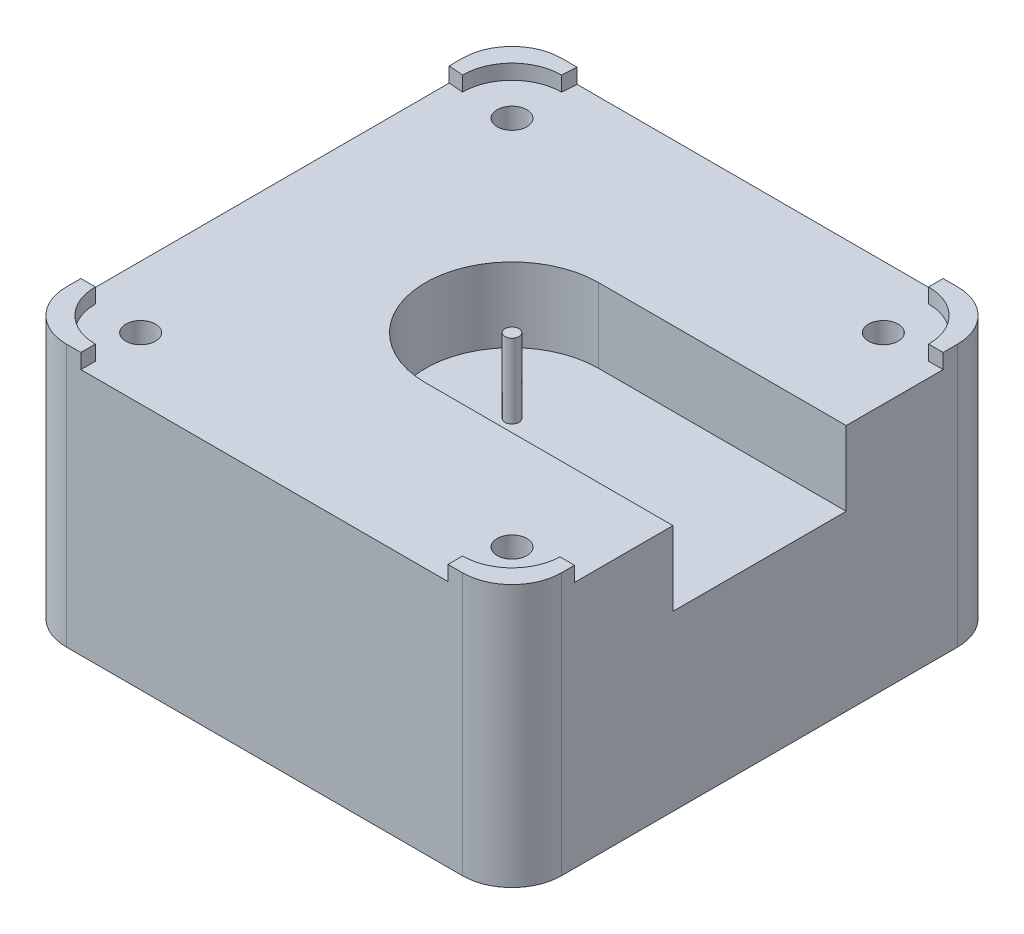
ISO-10303-21;
HEADER;
FILE_DESCRIPTION(('STEP AP214'),'2;1');
FILE_NAME('part.step','',(''),(''),'','','');
FILE_SCHEMA(('AUTOMOTIVE_DESIGN { 1 0 10303 214 1 1 1 1 }'));
ENDSEC;
DATA;
#1=APPLICATION_CONTEXT('core data for automotive mechanical design processes');
#2=APPLICATION_PROTOCOL_DEFINITION('international standard','automotive_design',2000,#1);
#3=PRODUCT_CONTEXT('',#1,'mechanical');
#4=PRODUCT('Part','Part','',(#3));
#5=PRODUCT_RELATED_PRODUCT_CATEGORY('part','',(#4));
#6=PRODUCT_DEFINITION_FORMATION('','',#4);
#7=PRODUCT_DEFINITION_CONTEXT('part definition',#1,'design');
#8=PRODUCT_DEFINITION('design','',#6,#7);
#9=PRODUCT_DEFINITION_SHAPE('','',#8);
#10=(LENGTH_UNIT() NAMED_UNIT(*) SI_UNIT(.MILLI.,.METRE.));
#11=(NAMED_UNIT(*) PLANE_ANGLE_UNIT() SI_UNIT($,.RADIAN.));
#12=(NAMED_UNIT(*) SI_UNIT($,.STERADIAN.) SOLID_ANGLE_UNIT());
#13=UNCERTAINTY_MEASURE_WITH_UNIT(LENGTH_MEASURE(1.E-05),#10,'distance_accuracy_value','');
#14=(GEOMETRIC_REPRESENTATION_CONTEXT(3) GLOBAL_UNCERTAINTY_ASSIGNED_CONTEXT((#13)) GLOBAL_UNIT_ASSIGNED_CONTEXT((#10,
#11,#12)) REPRESENTATION_CONTEXT('',''));
#15=CARTESIAN_POINT('',(0.,0.,0.));
#16=DIRECTION('',(0.,0.,1.));
#17=DIRECTION('',(1.,0.,0.));
#18=AXIS2_PLACEMENT_3D('',#15,#16,#17);
#19=CARTESIAN_POINT('',(0.,50.,0.));
#20=DIRECTION('',(0.,1.,0.));
#21=DIRECTION('',(0.,0.,1.));
#22=AXIS2_PLACEMENT_3D('',#19,#20,#21);
#23=PLANE('',#22);
#24=DIRECTION('',(0.,0.,1.));
#25=VECTOR('',#24,1.);
#26=CARTESIAN_POINT('',(-35.668490101477,50.,-9.29519148590413E-13));
#27=LINE('',#26,#25);
#28=CARTESIAN_POINT('',(-35.6684901014788,50.,69.0195136041323));
#29=VERTEX_POINT('',#28);
#30=CARTESIAN_POINT('',(-35.6684901014788,50.,71.9484457922669));
#31=VERTEX_POINT('',#30);
#32=EDGE_CURVE('E257',#29,#31,#27,.T.);
#33=ORIENTED_EDGE('',*,*,#32,.T.);
#34=DIRECTION('',(1.,0.,0.));
#35=VECTOR('',#34,1.);
#36=CARTESIAN_POINT('',(-48.5974222896133,50.,71.9484457922669));
#37=LINE('',#36,#35);
#38=CARTESIAN_POINT('',(38.4736455222521,50.,71.9484457922669));
#39=VERTEX_POINT('',#38);
#40=EDGE_CURVE('E442',#31,#39,#37,.T.);
#41=ORIENTED_EDGE('',*,*,#40,.T.);
#42=DIRECTION('',(0.,0.,1.));
#43=VECTOR('',#42,1.);
#44=CARTESIAN_POINT('',(38.4736455222504,50.,-9.11473968079353E-13));
#45=LINE('',#44,#43);
#46=CARTESIAN_POINT('',(38.4736455222521,50.,69.0195136041323));
#47=VERTEX_POINT('',#46);
#48=EDGE_CURVE('E327',#47,#39,#45,.T.);
#49=ORIENTED_EDGE('',*,*,#48,.F.);
#50=CARTESIAN_POINT('',(38.4736455222521,50.,59.0195136041323));
#51=DIRECTION('',(0.,1.,0.));
#52=DIRECTION('',(0.,0.,1.));
#53=AXIS2_PLACEMENT_3D('',#50,#51,#52);
#54=CIRCLE('',#53,10.);
#55=CARTESIAN_POINT('',(48.4689491929749,50.,59.3259520645704));
#56=VERTEX_POINT('',#55);
#57=EDGE_CURVE('E342',#56,#47,#54,.F.);
#58=ORIENTED_EDGE('',*,*,#57,.F.);
#59=DIRECTION('',(1.,0.,0.));
#60=VECTOR('',#59,1.);
#61=CARTESIAN_POINT('',(0.,50.,59.3259520645704));
#62=LINE('',#61,#60);
#63=CARTESIAN_POINT('',(51.4025777103867,50.,59.3259520645704));
#64=VERTEX_POINT('',#63);
#65=EDGE_CURVE('E322',#56,#64,#62,.T.);
#66=ORIENTED_EDGE('',*,*,#65,.T.);
#67=DIRECTION('',(0.,0.,-1.));
#68=VECTOR('',#67,1.);
#69=CARTESIAN_POINT('',(51.4025777103867,50.,-28.0515542077331));
#70=LINE('',#69,#68);
#71=CARTESIAN_POINT('',(51.4025777103867,50.,39.4484457922669));
#72=VERTEX_POINT('',#71);
#73=EDGE_CURVE('E446',#64,#72,#70,.T.);
#74=ORIENTED_EDGE('',*,*,#73,.T.);
#75=DIRECTION('',(1.,0.,0.));
#76=VECTOR('',#75,1.);
#77=CARTESIAN_POINT('',(1.40257771038666,50.,39.4484457922669));
#78=LINE('',#77,#76);
#79=CARTESIAN_POINT('',(1.40257771038666,50.,39.4484457922669));
#80=VERTEX_POINT('',#79);
#81=EDGE_CURVE('E428',#80,#72,#78,.T.);
#82=ORIENTED_EDGE('',*,*,#81,.F.);
#83=CARTESIAN_POINT('',(1.40257771038667,50.,21.9484457922669));
#84=DIRECTION('',(0.,1.,0.));
#85=DIRECTION('',(0.,0.,1.));
#86=AXIS2_PLACEMENT_3D('',#83,#84,#85);
#87=CIRCLE('',#86,17.5);
#88=CARTESIAN_POINT('',(1.40257771038666,50.,4.44844579226686));
#89=VERTEX_POINT('',#88);
#90=EDGE_CURVE('E232',#89,#80,#87,.T.);
#91=ORIENTED_EDGE('',*,*,#90,.F.);
#92=DIRECTION('',(-1.,0.,0.));
#93=VECTOR('',#92,1.);
#94=CARTESIAN_POINT('',(1.40257771038666,50.,4.44844579226686));
#95=LINE('',#94,#93);
#96=CARTESIAN_POINT('',(51.4025777103867,50.,4.44844579226687));
#97=VERTEX_POINT('',#96);
#98=EDGE_CURVE('E237',#97,#89,#95,.T.);
#99=ORIENTED_EDGE('',*,*,#98,.F.);
#100=CARTESIAN_POINT('',(51.4025777103867,50.,-15.1226220195985));
#101=VERTEX_POINT('',#100);
#102=EDGE_CURVE('E445',#97,#101,#70,.T.);
#103=ORIENTED_EDGE('',*,*,#102,.T.);
#104=DIRECTION('',(1.,0.,0.));
#105=VECTOR('',#104,1.);
#106=CARTESIAN_POINT('',(0.,50.,-15.1226220195985));
#107=LINE('',#106,#105);
#108=CARTESIAN_POINT('',(48.4736455222521,50.,-15.1226220195985));
#109=VERTEX_POINT('',#108);
#110=EDGE_CURVE('E359',#109,#101,#107,.T.);
#111=ORIENTED_EDGE('',*,*,#110,.F.);
#112=CARTESIAN_POINT('',(38.4736455222521,50.,-15.1226220195986));
#113=DIRECTION('',(0.,1.,0.));
#114=DIRECTION('',(0.,0.,1.));
#115=AXIS2_PLACEMENT_3D('',#112,#113,#114);
#116=CIRCLE('',#115,10.);
#117=CARTESIAN_POINT('',(38.4736455222521,50.,-25.1226220195986));
#118=VERTEX_POINT('',#117);
#119=EDGE_CURVE('E55',#118,#109,#116,.F.);
#120=ORIENTED_EDGE('',*,*,#119,.F.);
#121=DIRECTION('',(0.,0.,-1.));
#122=VECTOR('',#121,1.);
#123=CARTESIAN_POINT('',(38.4736455222521,50.,0.));
#124=LINE('',#123,#122);
#125=CARTESIAN_POINT('',(38.4736455222521,50.,-28.0515542077331));
#126=VERTEX_POINT('',#125);
#127=EDGE_CURVE('E60',#118,#126,#124,.T.);
#128=ORIENTED_EDGE('',*,*,#127,.T.);
#129=DIRECTION('',(-1.,0.,0.));
#130=VECTOR('',#129,1.);
#131=CARTESIAN_POINT('',(-48.5974222896134,50.,-28.0515542077331));
#132=LINE('',#131,#130);
#133=CARTESIAN_POINT('',(-35.4404761380209,50.,-28.0515542077331));
#134=VERTEX_POINT('',#133);
#135=EDGE_CURVE('E48',#126,#134,#132,.T.);
#136=ORIENTED_EDGE('',*,*,#135,.T.);
#137=DIRECTION('',(0.0776140043429379,0.,-0.996983483478966));
#138=VECTOR('',#137,1.);
#139=CARTESIAN_POINT('',(-37.3976109706205,50.,-2.91136050735838));
#140=LINE('',#139,#138);
#141=CARTESIAN_POINT('',(-35.6684901014788,50.,-25.1226220195986));
#142=VERTEX_POINT('',#141);
#143=EDGE_CURVE('E310',#142,#134,#140,.T.);
#144=ORIENTED_EDGE('',*,*,#143,.F.);
#145=CARTESIAN_POINT('',(-35.6684901014788,50.,-15.1226220195986));
#146=DIRECTION('',(0.,1.,0.));
#147=DIRECTION('',(0.,0.,1.));
#148=AXIS2_PLACEMENT_3D('',#145,#146,#147);
#149=CIRCLE('',#148,10.);
#150=CARTESIAN_POINT('',(-45.6684901014788,50.,-15.1226220195985));
#151=VERTEX_POINT('',#150);
#152=EDGE_CURVE('E289',#142,#151,#149,.T.);
#153=ORIENTED_EDGE('',*,*,#152,.T.);
#154=DIRECTION('',(-0.996309152553865,0.,-0.0858374774640981));
#155=VECTOR('',#154,1.);
#156=CARTESIAN_POINT('',(0.956807935292815,50.,-11.1055978266266));
#157=LINE('',#156,#155);
#158=CARTESIAN_POINT('',(-48.5974222896133,50.,-15.3749655316986));
#159=VERTEX_POINT('',#158);
#160=EDGE_CURVE('E294',#151,#159,#157,.T.);
#161=ORIENTED_EDGE('',*,*,#160,.T.);
#162=DIRECTION('',(0.,0.,1.));
#163=VECTOR('',#162,1.);
#164=CARTESIAN_POINT('',(-48.5974222896134,50.,-28.0515542077331));
#165=LINE('',#164,#163);
#166=CARTESIAN_POINT('',(-48.5974222896133,50.,59.0195136041323));
#167=VERTEX_POINT('',#166);
#168=EDGE_CURVE('E439',#159,#167,#165,.T.);
#169=ORIENTED_EDGE('',*,*,#168,.T.);
#170=DIRECTION('',(-1.,0.,0.));
#171=VECTOR('',#170,1.);
#172=CARTESIAN_POINT('',(1.53804570587249E-12,50.,59.0195136041311));
#173=LINE('',#172,#171);
#174=CARTESIAN_POINT('',(-45.6684901014788,50.,59.0195136041323));
#175=VERTEX_POINT('',#174);
#176=EDGE_CURVE('E262',#175,#167,#173,.T.);
#177=ORIENTED_EDGE('',*,*,#176,.F.);
#178=CARTESIAN_POINT('',(-35.6684901014788,50.,59.0195136041323));
#179=DIRECTION('',(0.,1.,0.));
#180=DIRECTION('',(0.,0.,1.));
#181=AXIS2_PLACEMENT_3D('',#178,#179,#180);
#182=CIRCLE('',#181,9.99999999999999);
#183=EDGE_CURVE('E277',#29,#175,#182,.F.);
#184=ORIENTED_EDGE('',*,*,#183,.F.);
#185=EDGE_LOOP('',(#33,#41,#49,#58,#66,#74,#82,#91,#99,#103,#111,#120,#128,#136,#144,#153,#161,
#169,#177,#184));
#186=FACE_BOUND('',#185,.T.);
#187=CARTESIAN_POINT('',(38.9025777103874,50.,59.4484457922669));
#188=DIRECTION('',(0.,1.,0.));
#189=DIRECTION('',(0.,0.,1.));
#190=AXIS2_PLACEMENT_3D('',#187,#188,#189);
#191=CIRCLE('',#190,3.);
#192=CARTESIAN_POINT('',(38.9025777103874,50.,62.4484457922669));
#193=VERTEX_POINT('',#192);
#194=EDGE_CURVE('E413',#193,#193,#191,.T.);
#195=ORIENTED_EDGE('',*,*,#194,.F.);
#196=EDGE_LOOP('',(#195));
#197=FACE_BOUND('',#196,.T.);
#198=CARTESIAN_POINT('',(-36.0974222896126,50.,59.4484457922674));
#199=DIRECTION('',(0.,1.,0.));
#200=DIRECTION('',(0.,0.,1.));
#201=AXIS2_PLACEMENT_3D('',#198,#199,#200);
#202=CIRCLE('',#201,3.);
#203=CARTESIAN_POINT('',(-36.0974222896126,50.,62.4484457922674));
#204=VERTEX_POINT('',#203);
#205=EDGE_CURVE('E419',#204,#204,#202,.T.);
#206=ORIENTED_EDGE('',*,*,#205,.F.);
#207=EDGE_LOOP('',(#206));
#208=FACE_BOUND('',#207,.T.);
#209=CARTESIAN_POINT('',(-36.0974222896133,50.,-15.5515542077326));
#210=DIRECTION('',(0.,1.,0.));
#211=DIRECTION('',(0.,0.,1.));
#212=AXIS2_PLACEMENT_3D('',#209,#210,#211);
#213=CIRCLE('',#212,3.);
#214=CARTESIAN_POINT('',(-36.0974222896133,50.,-12.5515542077326));
#215=VERTEX_POINT('',#214);
#216=EDGE_CURVE('E415',#215,#215,#213,.T.);
#217=ORIENTED_EDGE('',*,*,#216,.F.);
#218=EDGE_LOOP('',(#217));
#219=FACE_BOUND('',#218,.T.);
#220=CARTESIAN_POINT('',(38.9025777103867,50.,-15.5515542077331));
#221=DIRECTION('',(0.,1.,0.));
#222=DIRECTION('',(0.,0.,1.));
#223=AXIS2_PLACEMENT_3D('',#220,#221,#222);
#224=CIRCLE('',#223,3.);
#225=CARTESIAN_POINT('',(38.9025777103867,50.,-12.5515542077331));
#226=VERTEX_POINT('',#225);
#227=EDGE_CURVE('E418',#226,#226,#224,.T.);
#228=ORIENTED_EDGE('',*,*,#227,.F.);
#229=EDGE_LOOP('',(#228));
#230=FACE_BOUND('',#229,.T.);
#231=ADVANCED_FACE('F40',(#186,#197,#208,#219,#230),#23,.T.);
#232=CARTESIAN_POINT('',(-48.5974222896134,50.,-28.0515542077331));
#233=DIRECTION('',(1.,0.,0.));
#234=DIRECTION('',(0.,0.,-1.));
#235=AXIS2_PLACEMENT_3D('',#232,#233,#234);
#236=PLANE('',#235);
#237=ORIENTED_EDGE('',*,*,#168,.F.);
#238=DIRECTION('',(0.,-1.,0.));
#239=VECTOR('',#238,1.);
#240=CARTESIAN_POINT('',(-48.5974222896133,53.,-15.3749655316986));
#241=LINE('',#240,#239);
#242=CARTESIAN_POINT('',(-48.5974222896133,53.,-15.3749655316986));
#243=VERTEX_POINT('',#242);
#244=EDGE_CURVE('E315',#243,#159,#241,.T.);
#245=ORIENTED_EDGE('',*,*,#244,.F.);
#246=DIRECTION('',(0.,0.,1.));
#247=VECTOR('',#246,1.);
#248=CARTESIAN_POINT('',(-48.5974222896133,53.,0.));
#249=LINE('',#248,#247);
#250=CARTESIAN_POINT('',(-48.5974222896133,53.,-18.0515542077331));
#251=VERTEX_POINT('',#250);
#252=EDGE_CURVE('E302',#251,#243,#249,.T.);
#253=ORIENTED_EDGE('',*,*,#252,.F.);
#254=DIRECTION('',(0.,1.,0.));
#255=VECTOR('',#254,1.);
#256=CARTESIAN_POINT('',(-48.5974222896134,0.,-18.0515542077331));
#257=LINE('',#256,#255);
#258=CARTESIAN_POINT('',(-48.5974222896134,0.,-18.0515542077331));
#259=VERTEX_POINT('',#258);
#260=EDGE_CURVE('E386',#259,#251,#257,.T.);
#261=ORIENTED_EDGE('',*,*,#260,.F.);
#262=DIRECTION('',(0.,0.,1.));
#263=VECTOR('',#262,1.);
#264=CARTESIAN_POINT('',(-48.5974222896134,0.,-28.0515542077331));
#265=LINE('',#264,#263);
#266=CARTESIAN_POINT('',(-48.5974222896133,0.,61.9484457922668));
#267=VERTEX_POINT('',#266);
#268=EDGE_CURVE('E435',#259,#267,#265,.T.);
#269=ORIENTED_EDGE('',*,*,#268,.T.);
#270=DIRECTION('',(0.,1.,0.));
#271=VECTOR('',#270,1.);
#272=CARTESIAN_POINT('',(-48.5974222896134,0.,61.9484457922668));
#273=LINE('',#272,#271);
#274=CARTESIAN_POINT('',(-48.5974222896134,53.,61.9484457922668));
#275=VERTEX_POINT('',#274);
#276=EDGE_CURVE('E410',#267,#275,#273,.T.);
#277=ORIENTED_EDGE('',*,*,#276,.T.);
#278=DIRECTION('',(0.,0.,1.));
#279=VECTOR('',#278,1.);
#280=CARTESIAN_POINT('',(-48.5974222896133,53.,0.));
#281=LINE('',#280,#279);
#282=CARTESIAN_POINT('',(-48.5974222896133,53.,59.0195136041323));
#283=VERTEX_POINT('',#282);
#284=EDGE_CURVE('E266',#283,#275,#281,.T.);
#285=ORIENTED_EDGE('',*,*,#284,.F.);
#286=DIRECTION('',(0.,-1.,0.));
#287=VECTOR('',#286,1.);
#288=CARTESIAN_POINT('',(-48.5974222896133,53.,59.0195136041323));
#289=LINE('',#288,#287);
#290=EDGE_CURVE('E281',#283,#167,#289,.T.);
#291=ORIENTED_EDGE('',*,*,#290,.T.);
#292=EDGE_LOOP('',(#237,#245,#253,#261,#269,#277,#285,#291));
#293=FACE_BOUND('',#292,.T.);
#294=ADVANCED_FACE('F42',(#293),#236,.F.);
#295=CARTESIAN_POINT('',(-48.5974222896133,50.,71.9484457922669));
#296=DIRECTION('',(0.,0.,-1.));
#297=DIRECTION('',(-1.,0.,0.));
#298=AXIS2_PLACEMENT_3D('',#295,#296,#297);
#299=PLANE('',#298);
#300=DIRECTION('',(0.,1.,0.));
#301=VECTOR('',#300,1.);
#302=CARTESIAN_POINT('',(41.4025777103866,0.,71.9484457922669));
#303=LINE('',#302,#301);
#304=CARTESIAN_POINT('',(41.4025777103866,0.,71.9484457922669));
#305=VERTEX_POINT('',#304);
#306=CARTESIAN_POINT('',(41.4025777103867,53.,71.9484457922669));
#307=VERTEX_POINT('',#306);
#308=EDGE_CURVE('E387',#305,#307,#303,.T.);
#309=ORIENTED_EDGE('',*,*,#308,.T.);
#310=DIRECTION('',(1.,0.,0.));
#311=VECTOR('',#310,1.);
#312=CARTESIAN_POINT('',(0.,53.,71.9484457922669));
#313=LINE('',#312,#311);
#314=CARTESIAN_POINT('',(38.4736455222521,53.,71.9484457922669));
#315=VERTEX_POINT('',#314);
#316=EDGE_CURVE('E331',#315,#307,#313,.T.);
#317=ORIENTED_EDGE('',*,*,#316,.F.);
#318=DIRECTION('',(0.,-1.,0.));
#319=VECTOR('',#318,1.);
#320=CARTESIAN_POINT('',(38.4736455222521,53.,71.9484457922669));
#321=LINE('',#320,#319);
#322=EDGE_CURVE('E347',#315,#39,#321,.T.);
#323=ORIENTED_EDGE('',*,*,#322,.T.);
#324=ORIENTED_EDGE('',*,*,#40,.F.);
#325=DIRECTION('',(0.,-1.,0.));
#326=VECTOR('',#325,1.);
#327=CARTESIAN_POINT('',(-35.6684901014788,53.,71.9484457922669));
#328=LINE('',#327,#326);
#329=CARTESIAN_POINT('',(-35.6684901014788,53.,71.9484457922669));
#330=VERTEX_POINT('',#329);
#331=EDGE_CURVE('E274',#330,#31,#328,.T.);
#332=ORIENTED_EDGE('',*,*,#331,.F.);
#333=DIRECTION('',(1.,0.,0.));
#334=VECTOR('',#333,1.);
#335=CARTESIAN_POINT('',(0.,53.,71.9484457922669));
#336=LINE('',#335,#334);
#337=CARTESIAN_POINT('',(-38.5974222896133,53.,71.9484457922669));
#338=VERTEX_POINT('',#337);
#339=EDGE_CURVE('E272',#338,#330,#336,.T.);
#340=ORIENTED_EDGE('',*,*,#339,.F.);
#341=DIRECTION('',(0.,1.,0.));
#342=VECTOR('',#341,1.);
#343=CARTESIAN_POINT('',(-38.5974222896133,0.,71.9484457922669));
#344=LINE('',#343,#342);
#345=CARTESIAN_POINT('',(-38.5974222896133,0.,71.9484457922669));
#346=VERTEX_POINT('',#345);
#347=EDGE_CURVE('E411',#346,#338,#344,.T.);
#348=ORIENTED_EDGE('',*,*,#347,.F.);
#349=DIRECTION('',(1.,0.,0.));
#350=VECTOR('',#349,1.);
#351=CARTESIAN_POINT('',(-48.5974222896133,0.,71.9484457922669));
#352=LINE('',#351,#350);
#353=EDGE_CURVE('E451',#346,#305,#352,.T.);
#354=ORIENTED_EDGE('',*,*,#353,.T.);
#355=EDGE_LOOP('',(#309,#317,#323,#324,#332,#340,#348,#354));
#356=FACE_BOUND('',#355,.T.);
#357=ADVANCED_FACE('F494',(#356),#299,.F.);
#358=CARTESIAN_POINT('',(51.4025777103867,50.,-28.0515542077331));
#359=DIRECTION('',(-1.,0.,0.));
#360=DIRECTION('',(0.,0.,1.));
#361=AXIS2_PLACEMENT_3D('',#358,#359,#360);
#362=PLANE('',#361);
#363=DIRECTION('',(0.,1.,0.));
#364=VECTOR('',#363,1.);
#365=CARTESIAN_POINT('',(51.4025777103867,38.,4.44844579226687));
#366=LINE('',#365,#364);
#367=CARTESIAN_POINT('',(51.4025777103867,35.,4.44844579226687));
#368=VERTEX_POINT('',#367);
#369=EDGE_CURVE('E436',#368,#97,#366,.T.);
#370=ORIENTED_EDGE('',*,*,#369,.F.);
#371=DIRECTION('',(0.,0.,-1.));
#372=VECTOR('',#371,1.);
#373=CARTESIAN_POINT('',(51.4025777103867,35.,-28.0515542077331));
#374=LINE('',#373,#372);
#375=CARTESIAN_POINT('',(51.4025777103867,35.,39.4484457922669));
#376=VERTEX_POINT('',#375);
#377=EDGE_CURVE('E11',#376,#368,#374,.T.);
#378=ORIENTED_EDGE('',*,*,#377,.F.);
#379=DIRECTION('',(0.,1.,0.));
#380=VECTOR('',#379,1.);
#381=CARTESIAN_POINT('',(51.4025777103867,38.,39.4484457922669));
#382=LINE('',#381,#380);
#383=EDGE_CURVE('E236',#376,#72,#382,.T.);
#384=ORIENTED_EDGE('',*,*,#383,.T.);
#385=ORIENTED_EDGE('',*,*,#73,.F.);
#386=DIRECTION('',(0.,-1.,0.));
#387=VECTOR('',#386,1.);
#388=CARTESIAN_POINT('',(51.4025777103867,53.,59.3259520645704));
#389=LINE('',#388,#387);
#390=CARTESIAN_POINT('',(51.4025777103867,53.,59.3259520645704));
#391=VERTEX_POINT('',#390);
#392=EDGE_CURVE('E339',#391,#64,#389,.T.);
#393=ORIENTED_EDGE('',*,*,#392,.F.);
#394=DIRECTION('',(0.,0.,-1.));
#395=VECTOR('',#394,1.);
#396=CARTESIAN_POINT('',(51.4025777103867,53.,0.));
#397=LINE('',#396,#395);
#398=CARTESIAN_POINT('',(51.4025777103867,53.,61.9484457922668));
#399=VERTEX_POINT('',#398);
#400=EDGE_CURVE('E337',#399,#391,#397,.T.);
#401=ORIENTED_EDGE('',*,*,#400,.F.);
#402=DIRECTION('',(0.,1.,0.));
#403=VECTOR('',#402,1.);
#404=CARTESIAN_POINT('',(51.4025777103867,0.,61.9484457922668));
#405=LINE('',#404,#403);
#406=CARTESIAN_POINT('',(51.4025777103867,0.,61.9484457922668));
#407=VERTEX_POINT('',#406);
#408=EDGE_CURVE('E390',#407,#399,#405,.T.);
#409=ORIENTED_EDGE('',*,*,#408,.F.);
#410=DIRECTION('',(0.,0.,-1.));
#411=VECTOR('',#410,1.);
#412=CARTESIAN_POINT('',(51.4025777103867,0.,-28.0515542077331));
#413=LINE('',#412,#411);
#414=CARTESIAN_POINT('',(51.4025777103867,0.,-18.0515542077331));
#415=VERTEX_POINT('',#414);
#416=EDGE_CURVE('E454',#407,#415,#413,.T.);
#417=ORIENTED_EDGE('',*,*,#416,.T.);
#418=DIRECTION('',(0.,1.,0.));
#419=VECTOR('',#418,1.);
#420=CARTESIAN_POINT('',(51.4025777103867,0.,-18.0515542077331));
#421=LINE('',#420,#419);
#422=CARTESIAN_POINT('',(51.4025777103867,53.,-18.0515542077331));
#423=VERTEX_POINT('',#422);
#424=EDGE_CURVE('E396',#415,#423,#421,.T.);
#425=ORIENTED_EDGE('',*,*,#424,.T.);
#426=DIRECTION('',(0.,0.,-1.));
#427=VECTOR('',#426,1.);
#428=CARTESIAN_POINT('',(51.4025777103867,53.,0.));
#429=LINE('',#428,#427);
#430=CARTESIAN_POINT('',(51.4025777103867,53.,-15.1226220195985));
#431=VERTEX_POINT('',#430);
#432=EDGE_CURVE('E363',#431,#423,#429,.T.);
#433=ORIENTED_EDGE('',*,*,#432,.F.);
#434=DIRECTION('',(0.,-1.,0.));
#435=VECTOR('',#434,1.);
#436=CARTESIAN_POINT('',(51.4025777103867,53.,-15.1226220195985));
#437=LINE('',#436,#435);
#438=EDGE_CURVE('E378',#431,#101,#437,.T.);
#439=ORIENTED_EDGE('',*,*,#438,.T.);
#440=ORIENTED_EDGE('',*,*,#102,.F.);
#441=EDGE_LOOP('',(#370,#378,#384,#385,#393,#401,#409,#417,#425,#433,#439,#440));
#442=FACE_BOUND('',#441,.T.);
#443=ADVANCED_FACE('F505',(#442),#362,.F.);
#444=CARTESIAN_POINT('',(-48.5974222896134,50.,-28.0515542077331));
#445=DIRECTION('',(0.,0.,1.));
#446=DIRECTION('',(1.,0.,0.));
#447=AXIS2_PLACEMENT_3D('',#444,#445,#446);
#448=PLANE('',#447);
#449=DIRECTION('',(0.,1.,0.));
#450=VECTOR('',#449,1.);
#451=CARTESIAN_POINT('',(-38.5974222896133,0.,-28.0515542077331));
#452=LINE('',#451,#450);
#453=CARTESIAN_POINT('',(-38.5974222896133,0.,-28.0515542077331));
#454=VERTEX_POINT('',#453);
#455=CARTESIAN_POINT('',(-38.5974222896133,53.,-28.0515542077331));
#456=VERTEX_POINT('',#455);
#457=EDGE_CURVE('E403',#454,#456,#452,.T.);
#458=ORIENTED_EDGE('',*,*,#457,.T.);
#459=DIRECTION('',(-1.,0.,0.));
#460=VECTOR('',#459,1.);
#461=CARTESIAN_POINT('',(0.,53.,-28.0515542077331));
#462=LINE('',#461,#460);
#463=CARTESIAN_POINT('',(-35.4404761380209,53.,-28.0515542077331));
#464=VERTEX_POINT('',#463);
#465=EDGE_CURVE('E296',#464,#456,#462,.T.);
#466=ORIENTED_EDGE('',*,*,#465,.F.);
#467=DIRECTION('',(0.,-1.,0.));
#468=VECTOR('',#467,1.);
#469=CARTESIAN_POINT('',(-35.4404761380209,53.,-28.0515542077331));
#470=LINE('',#469,#468);
#471=EDGE_CURVE('E317',#464,#134,#470,.T.);
#472=ORIENTED_EDGE('',*,*,#471,.T.);
#473=ORIENTED_EDGE('',*,*,#135,.F.);
#474=DIRECTION('',(0.,-1.,0.));
#475=VECTOR('',#474,1.);
#476=CARTESIAN_POINT('',(38.4736455222521,53.,-28.0515542077331));
#477=LINE('',#476,#475);
#478=CARTESIAN_POINT('',(38.4736455222521,53.,-28.0515542077331));
#479=VERTEX_POINT('',#478);
#480=EDGE_CURVE('E371',#479,#126,#477,.T.);
#481=ORIENTED_EDGE('',*,*,#480,.F.);
#482=DIRECTION('',(-1.,0.,0.));
#483=VECTOR('',#482,1.);
#484=CARTESIAN_POINT('',(0.,53.,-28.0515542077331));
#485=LINE('',#484,#483);
#486=CARTESIAN_POINT('',(41.4025777103866,53.,-28.0515542077331));
#487=VERTEX_POINT('',#486);
#488=EDGE_CURVE('E369',#487,#479,#485,.T.);
#489=ORIENTED_EDGE('',*,*,#488,.F.);
#490=DIRECTION('',(0.,1.,0.));
#491=VECTOR('',#490,1.);
#492=CARTESIAN_POINT('',(41.4025777103866,0.,-28.0515542077331));
#493=LINE('',#492,#491);
#494=CARTESIAN_POINT('',(41.4025777103866,0.,-28.0515542077331));
#495=VERTEX_POINT('',#494);
#496=EDGE_CURVE('E398',#495,#487,#493,.T.);
#497=ORIENTED_EDGE('',*,*,#496,.F.);
#498=DIRECTION('',(-1.,0.,0.));
#499=VECTOR('',#498,1.);
#500=CARTESIAN_POINT('',(-48.5974222896134,0.,-28.0515542077331));
#501=LINE('',#500,#499);
#502=EDGE_CURVE('E443',#495,#454,#501,.T.);
#503=ORIENTED_EDGE('',*,*,#502,.T.);
#504=EDGE_LOOP('',(#458,#466,#472,#473,#481,#489,#497,#503));
#505=FACE_BOUND('',#504,.T.);
#506=ADVANCED_FACE('F502',(#505),#448,.F.);
#507=CARTESIAN_POINT('',(0.,0.,0.));
#508=DIRECTION('',(0.,1.,0.));
#509=DIRECTION('',(0.,0.,1.));
#510=AXIS2_PLACEMENT_3D('',#507,#508,#509);
#511=PLANE('',#510);
#512=CARTESIAN_POINT('',(38.9025777103874,0.,59.4484457922669));
#513=DIRECTION('',(0.,1.,0.));
#514=DIRECTION('',(0.,0.,1.));
#515=AXIS2_PLACEMENT_3D('',#512,#513,#514);
#516=CIRCLE('',#515,3.);
#517=CARTESIAN_POINT('',(38.9025777103874,0.,62.4484457922669));
#518=VERTEX_POINT('',#517);
#519=EDGE_CURVE('E429',#518,#518,#516,.T.);
#520=ORIENTED_EDGE('',*,*,#519,.T.);
#521=EDGE_LOOP('',(#520));
#522=FACE_BOUND('',#521,.T.);
#523=CARTESIAN_POINT('',(-36.0974222896126,0.,59.4484457922674));
#524=DIRECTION('',(0.,1.,0.));
#525=DIRECTION('',(0.,0.,1.));
#526=AXIS2_PLACEMENT_3D('',#523,#524,#525);
#527=CIRCLE('',#526,3.);
#528=CARTESIAN_POINT('',(-36.0974222896126,0.,62.4484457922674));
#529=VERTEX_POINT('',#528);
#530=EDGE_CURVE('E464',#529,#529,#527,.T.);
#531=ORIENTED_EDGE('',*,*,#530,.T.);
#532=EDGE_LOOP('',(#531));
#533=FACE_BOUND('',#532,.T.);
#534=CARTESIAN_POINT('',(-36.0974222896133,0.,-15.5515542077326));
#535=DIRECTION('',(0.,1.,0.));
#536=DIRECTION('',(0.,0.,1.));
#537=AXIS2_PLACEMENT_3D('',#534,#535,#536);
#538=CIRCLE('',#537,3.);
#539=CARTESIAN_POINT('',(-36.0974222896133,0.,-12.5515542077326));
#540=VERTEX_POINT('',#539);
#541=EDGE_CURVE('E461',#540,#540,#538,.T.);
#542=ORIENTED_EDGE('',*,*,#541,.T.);
#543=EDGE_LOOP('',(#542));
#544=FACE_BOUND('',#543,.T.);
#545=CARTESIAN_POINT('',(38.9025777103867,0.,-15.5515542077331));
#546=DIRECTION('',(0.,1.,0.));
#547=DIRECTION('',(0.,0.,1.));
#548=AXIS2_PLACEMENT_3D('',#545,#546,#547);
#549=CIRCLE('',#548,3.);
#550=CARTESIAN_POINT('',(38.9025777103867,0.,-12.5515542077331));
#551=VERTEX_POINT('',#550);
#552=EDGE_CURVE('E426',#551,#551,#549,.T.);
#553=ORIENTED_EDGE('',*,*,#552,.T.);
#554=EDGE_LOOP('',(#553));
#555=FACE_BOUND('',#554,.T.);
#556=ORIENTED_EDGE('',*,*,#268,.F.);
#557=CARTESIAN_POINT('',(-38.5974222896134,0.,-18.0515542077331));
#558=DIRECTION('',(0.,-1.,0.));
#559=DIRECTION('',(0.,0.,1.));
#560=AXIS2_PLACEMENT_3D('',#557,#558,#559);
#561=CIRCLE('',#560,10.);
#562=EDGE_CURVE('E400',#259,#454,#561,.T.);
#563=ORIENTED_EDGE('',*,*,#562,.T.);
#564=ORIENTED_EDGE('',*,*,#502,.F.);
#565=CARTESIAN_POINT('',(41.4025777103867,0.,-18.0515542077331));
#566=DIRECTION('',(0.,-1.,0.));
#567=DIRECTION('',(0.,0.,-1.));
#568=AXIS2_PLACEMENT_3D('',#565,#566,#567);
#569=CIRCLE('',#568,10.);
#570=EDGE_CURVE('E392',#495,#415,#569,.T.);
#571=ORIENTED_EDGE('',*,*,#570,.T.);
#572=ORIENTED_EDGE('',*,*,#416,.F.);
#573=CARTESIAN_POINT('',(41.4025777103867,0.,61.9484457922669));
#574=DIRECTION('',(0.,-1.,0.));
#575=DIRECTION('',(0.,0.,1.));
#576=AXIS2_PLACEMENT_3D('',#573,#574,#575);
#577=CIRCLE('',#576,9.99999999999999);
#578=EDGE_CURVE('E389',#407,#305,#577,.T.);
#579=ORIENTED_EDGE('',*,*,#578,.T.);
#580=ORIENTED_EDGE('',*,*,#353,.F.);
#581=CARTESIAN_POINT('',(-38.5974222896134,0.,61.9484457922669));
#582=DIRECTION('',(0.,-1.,0.));
#583=DIRECTION('',(0.,0.,1.));
#584=AXIS2_PLACEMENT_3D('',#581,#582,#583);
#585=CIRCLE('',#584,10.);
#586=EDGE_CURVE('E395',#346,#267,#585,.T.);
#587=ORIENTED_EDGE('',*,*,#586,.T.);
#588=EDGE_LOOP('',(#556,#563,#564,#571,#572,#579,#580,#587));
#589=FACE_BOUND('',#588,.T.);
#590=ADVANCED_FACE('F469',(#522,#533,#544,#555,#589),#511,.F.);
#591=CARTESIAN_POINT('',(1.40257771038667,38.,21.9484457922669));
#592=DIRECTION('',(0.,1.,0.));
#593=DIRECTION('',(0.,0.,1.));
#594=AXIS2_PLACEMENT_3D('',#591,#592,#593);
#595=CYLINDRICAL_SURFACE('',#594,17.5);
#596=ORIENTED_EDGE('',*,*,#90,.T.);
#597=DIRECTION('',(0.,1.,0.));
#598=VECTOR('',#597,1.);
#599=CARTESIAN_POINT('',(1.40257771038666,38.,39.4484457922669));
#600=LINE('',#599,#598);
#601=CARTESIAN_POINT('',(1.40257771038666,35.,39.4484457922669));
#602=VERTEX_POINT('',#601);
#603=EDGE_CURVE('E225',#602,#80,#600,.T.);
#604=ORIENTED_EDGE('',*,*,#603,.F.);
#605=CARTESIAN_POINT('',(1.40257771038667,35.,21.9484457922669));
#606=DIRECTION('',(0.,1.,0.));
#607=DIRECTION('',(0.,0.,1.));
#608=AXIS2_PLACEMENT_3D('',#605,#606,#607);
#609=CIRCLE('',#608,17.5);
#610=CARTESIAN_POINT('',(1.40257771038666,35.,4.44844579226686));
#611=VERTEX_POINT('',#610);
#612=EDGE_CURVE('E229',#611,#602,#609,.T.);
#613=ORIENTED_EDGE('',*,*,#612,.F.);
#614=DIRECTION('',(0.,1.,0.));
#615=VECTOR('',#614,1.);
#616=CARTESIAN_POINT('',(1.40257771038666,38.,4.44844579226686));
#617=LINE('',#616,#615);
#618=EDGE_CURVE('E433',#611,#89,#617,.T.);
#619=ORIENTED_EDGE('',*,*,#618,.T.);
#620=EDGE_LOOP('',(#596,#604,#613,#619));
#621=FACE_BOUND('',#620,.T.);
#622=ADVANCED_FACE('F227',(#621),#595,.F.);
#623=CARTESIAN_POINT('',(1.40257771038666,38.,4.44844579226686));
#624=DIRECTION('',(0.,0.,-1.));
#625=DIRECTION('',(-1.,0.,0.));
#626=AXIS2_PLACEMENT_3D('',#623,#624,#625);
#627=PLANE('',#626);
#628=ORIENTED_EDGE('',*,*,#98,.T.);
#629=ORIENTED_EDGE('',*,*,#618,.F.);
#630=DIRECTION('',(-1.,0.,0.));
#631=VECTOR('',#630,1.);
#632=CARTESIAN_POINT('',(1.40257771038666,35.,4.44844579226686));
#633=LINE('',#632,#631);
#634=EDGE_CURVE('E245',#368,#611,#633,.T.);
#635=ORIENTED_EDGE('',*,*,#634,.F.);
#636=ORIENTED_EDGE('',*,*,#369,.T.);
#637=EDGE_LOOP('',(#628,#629,#635,#636));
#638=FACE_BOUND('',#637,.T.);
#639=ADVANCED_FACE('F588',(#638),#627,.F.);
#640=CARTESIAN_POINT('',(1.40257771038666,38.,39.4484457922669));
#641=DIRECTION('',(0.,0.,1.));
#642=DIRECTION('',(1.,0.,0.));
#643=AXIS2_PLACEMENT_3D('',#640,#641,#642);
#644=PLANE('',#643);
#645=ORIENTED_EDGE('',*,*,#81,.T.);
#646=ORIENTED_EDGE('',*,*,#383,.F.);
#647=DIRECTION('',(1.,0.,0.));
#648=VECTOR('',#647,1.);
#649=CARTESIAN_POINT('',(1.40257771038666,35.,39.4484457922669));
#650=LINE('',#649,#648);
#651=EDGE_CURVE('E240',#602,#376,#650,.T.);
#652=ORIENTED_EDGE('',*,*,#651,.F.);
#653=ORIENTED_EDGE('',*,*,#603,.T.);
#654=EDGE_LOOP('',(#645,#646,#652,#653));
#655=FACE_BOUND('',#654,.T.);
#656=ADVANCED_FACE('F241',(#655),#644,.F.);
#657=CARTESIAN_POINT('',(38.9025777103867,-50.,-15.5515542077331));
#658=DIRECTION('',(0.,1.,0.));
#659=DIRECTION('',(0.,0.,1.));
#660=AXIS2_PLACEMENT_3D('',#657,#658,#659);
#661=CYLINDRICAL_SURFACE('',#660,3.);
#662=ORIENTED_EDGE('',*,*,#227,.T.);
#663=EDGE_LOOP('',(#662));
#664=FACE_BOUND('',#663,.T.);
#665=ORIENTED_EDGE('',*,*,#552,.F.);
#666=EDGE_LOOP('',(#665));
#667=FACE_BOUND('',#666,.T.);
#668=ADVANCED_FACE('F569',(#664,#667),#661,.F.);
#669=CARTESIAN_POINT('',(-36.0974222896133,-50.,-15.5515542077326));
#670=DIRECTION('',(0.,1.,0.));
#671=DIRECTION('',(0.,0.,1.));
#672=AXIS2_PLACEMENT_3D('',#669,#670,#671);
#673=CYLINDRICAL_SURFACE('',#672,3.);
#674=ORIENTED_EDGE('',*,*,#216,.T.);
#675=EDGE_LOOP('',(#674));
#676=FACE_BOUND('',#675,.T.);
#677=ORIENTED_EDGE('',*,*,#541,.F.);
#678=EDGE_LOOP('',(#677));
#679=FACE_BOUND('',#678,.T.);
#680=ADVANCED_FACE('F485',(#676,#679),#673,.F.);
#681=CARTESIAN_POINT('',(-36.0974222896126,-50.,59.4484457922674));
#682=DIRECTION('',(0.,1.,0.));
#683=DIRECTION('',(0.,0.,1.));
#684=AXIS2_PLACEMENT_3D('',#681,#682,#683);
#685=CYLINDRICAL_SURFACE('',#684,3.);
#686=ORIENTED_EDGE('',*,*,#205,.T.);
#687=EDGE_LOOP('',(#686));
#688=FACE_BOUND('',#687,.T.);
#689=ORIENTED_EDGE('',*,*,#530,.F.);
#690=EDGE_LOOP('',(#689));
#691=FACE_BOUND('',#690,.T.);
#692=ADVANCED_FACE('F475',(#688,#691),#685,.F.);
#693=CARTESIAN_POINT('',(38.9025777103874,-50.,59.4484457922669));
#694=DIRECTION('',(0.,1.,0.));
#695=DIRECTION('',(0.,0.,1.));
#696=AXIS2_PLACEMENT_3D('',#693,#694,#695);
#697=CYLINDRICAL_SURFACE('',#696,3.);
#698=ORIENTED_EDGE('',*,*,#194,.T.);
#699=EDGE_LOOP('',(#698));
#700=FACE_BOUND('',#699,.T.);
#701=ORIENTED_EDGE('',*,*,#519,.F.);
#702=EDGE_LOOP('',(#701));
#703=FACE_BOUND('',#702,.T.);
#704=ADVANCED_FACE('F472',(#700,#703),#697,.F.);
#705=CARTESIAN_POINT('',(-38.5974222896134,0.,61.9484457922669));
#706=DIRECTION('',(0.,1.,0.));
#707=DIRECTION('',(0.,0.,1.));
#708=AXIS2_PLACEMENT_3D('',#705,#706,#707);
#709=CYLINDRICAL_SURFACE('',#708,10.);
#710=ORIENTED_EDGE('',*,*,#347,.T.);
#711=CARTESIAN_POINT('',(-38.5974222896134,53.,61.9484457922669));
#712=DIRECTION('',(0.,1.,0.));
#713=DIRECTION('',(0.,0.,1.));
#714=AXIS2_PLACEMENT_3D('',#711,#712,#713);
#715=CIRCLE('',#714,10.);
#716=EDGE_CURVE('E269',#275,#338,#715,.T.);
#717=ORIENTED_EDGE('',*,*,#716,.F.);
#718=ORIENTED_EDGE('',*,*,#276,.F.);
#719=ORIENTED_EDGE('',*,*,#586,.F.);
#720=EDGE_LOOP('',(#710,#717,#718,#719));
#721=FACE_BOUND('',#720,.T.);
#722=ADVANCED_FACE('F474',(#721),#709,.T.);
#723=CARTESIAN_POINT('',(41.4025777103867,0.,61.9484457922669));
#724=DIRECTION('',(0.,1.,0.));
#725=DIRECTION('',(0.,0.,1.));
#726=AXIS2_PLACEMENT_3D('',#723,#724,#725);
#727=CYLINDRICAL_SURFACE('',#726,9.99999999999999);
#728=ORIENTED_EDGE('',*,*,#408,.T.);
#729=CARTESIAN_POINT('',(41.4025777103867,53.,61.9484457922669));
#730=DIRECTION('',(0.,1.,0.));
#731=DIRECTION('',(0.,0.,1.));
#732=AXIS2_PLACEMENT_3D('',#729,#730,#731);
#733=CIRCLE('',#732,9.99999999999999);
#734=EDGE_CURVE('E334',#307,#399,#733,.T.);
#735=ORIENTED_EDGE('',*,*,#734,.F.);
#736=ORIENTED_EDGE('',*,*,#308,.F.);
#737=ORIENTED_EDGE('',*,*,#578,.F.);
#738=EDGE_LOOP('',(#728,#735,#736,#737));
#739=FACE_BOUND('',#738,.T.);
#740=ADVANCED_FACE('F482',(#739),#727,.T.);
#741=CARTESIAN_POINT('',(41.4025777103867,0.,-18.0515542077331));
#742=DIRECTION('',(0.,1.,0.));
#743=DIRECTION('',(0.,0.,1.));
#744=AXIS2_PLACEMENT_3D('',#741,#742,#743);
#745=CYLINDRICAL_SURFACE('',#744,10.);
#746=ORIENTED_EDGE('',*,*,#496,.T.);
#747=CARTESIAN_POINT('',(41.4025777103867,53.,-18.0515542077331));
#748=DIRECTION('',(0.,1.,0.));
#749=DIRECTION('',(0.,0.,1.));
#750=AXIS2_PLACEMENT_3D('',#747,#748,#749);
#751=CIRCLE('',#750,10.);
#752=EDGE_CURVE('E366',#423,#487,#751,.T.);
#753=ORIENTED_EDGE('',*,*,#752,.F.);
#754=ORIENTED_EDGE('',*,*,#424,.F.);
#755=ORIENTED_EDGE('',*,*,#570,.F.);
#756=EDGE_LOOP('',(#746,#753,#754,#755));
#757=FACE_BOUND('',#756,.T.);
#758=ADVANCED_FACE('F532',(#757),#745,.T.);
#759=CARTESIAN_POINT('',(-38.5974222896134,0.,-18.0515542077331));
#760=DIRECTION('',(0.,1.,0.));
#761=DIRECTION('',(0.,0.,1.));
#762=AXIS2_PLACEMENT_3D('',#759,#760,#761);
#763=CYLINDRICAL_SURFACE('',#762,10.);
#764=ORIENTED_EDGE('',*,*,#260,.T.);
#765=CARTESIAN_POINT('',(-38.5974222896134,53.,-18.0515542077331));
#766=DIRECTION('',(0.,1.,0.));
#767=DIRECTION('',(0.,0.,1.));
#768=AXIS2_PLACEMENT_3D('',#765,#766,#767);
#769=CIRCLE('',#768,10.);
#770=EDGE_CURVE('E299',#456,#251,#769,.T.);
#771=ORIENTED_EDGE('',*,*,#770,.F.);
#772=ORIENTED_EDGE('',*,*,#457,.F.);
#773=ORIENTED_EDGE('',*,*,#562,.F.);
#774=EDGE_LOOP('',(#764,#771,#772,#773));
#775=FACE_BOUND('',#774,.T.);
#776=ADVANCED_FACE('F553',(#775),#763,.T.);
#777=CARTESIAN_POINT('',(38.4736455222521,53.,0.));
#778=DIRECTION('',(-1.,0.,0.));
#779=DIRECTION('',(0.,0.,1.));
#780=AXIS2_PLACEMENT_3D('',#777,#778,#779);
#781=PLANE('',#780);
#782=ORIENTED_EDGE('',*,*,#127,.F.);
#783=DIRECTION('',(0.,-1.,0.));
#784=VECTOR('',#783,1.);
#785=CARTESIAN_POINT('',(38.4736455222521,53.,-25.1226220195986));
#786=LINE('',#785,#784);
#787=CARTESIAN_POINT('',(38.4736455222521,53.,-25.1226220195986));
#788=VERTEX_POINT('',#787);
#789=EDGE_CURVE('E384',#788,#118,#786,.T.);
#790=ORIENTED_EDGE('',*,*,#789,.F.);
#791=DIRECTION('',(0.,0.,-1.));
#792=VECTOR('',#791,1.);
#793=CARTESIAN_POINT('',(38.4736455222521,53.,0.));
#794=LINE('',#793,#792);
#795=EDGE_CURVE('E355',#788,#479,#794,.T.);
#796=ORIENTED_EDGE('',*,*,#795,.T.);
#797=ORIENTED_EDGE('',*,*,#480,.T.);
#798=EDGE_LOOP('',(#782,#790,#796,#797));
#799=FACE_BOUND('',#798,.T.);
#800=ADVANCED_FACE('F551',(#799),#781,.T.);
#801=CARTESIAN_POINT('',(38.4736455222521,53.,-15.1226220195986));
#802=DIRECTION('',(0.,-1.,0.));
#803=DIRECTION('',(0.,0.,-1.));
#804=AXIS2_PLACEMENT_3D('',#801,#802,#803);
#805=CYLINDRICAL_SURFACE('',#804,10.);
#806=ORIENTED_EDGE('',*,*,#119,.T.);
#807=DIRECTION('',(0.,-1.,0.));
#808=VECTOR('',#807,1.);
#809=CARTESIAN_POINT('',(48.4736455222521,53.,-15.1226220195985));
#810=LINE('',#809,#808);
#811=CARTESIAN_POINT('',(48.4736455222521,53.,-15.1226220195985));
#812=VERTEX_POINT('',#811);
#813=EDGE_CURVE('E381',#812,#109,#810,.T.);
#814=ORIENTED_EDGE('',*,*,#813,.F.);
#815=CARTESIAN_POINT('',(38.4736455222521,53.,-15.1226220195986));
#816=DIRECTION('',(0.,1.,0.));
#817=DIRECTION('',(0.,0.,1.));
#818=AXIS2_PLACEMENT_3D('',#815,#816,#817);
#819=CIRCLE('',#818,10.);
#820=EDGE_CURVE('E358',#788,#812,#819,.F.);
#821=ORIENTED_EDGE('',*,*,#820,.F.);
#822=ORIENTED_EDGE('',*,*,#789,.T.);
#823=EDGE_LOOP('',(#806,#814,#821,#822));
#824=FACE_BOUND('',#823,.T.);
#825=ADVANCED_FACE('F548',(#824),#805,.F.);
#826=CARTESIAN_POINT('',(0.,53.,-15.1226220195985));
#827=DIRECTION('',(0.,0.,-1.));
#828=DIRECTION('',(-1.,0.,0.));
#829=AXIS2_PLACEMENT_3D('',#826,#827,#828);
#830=PLANE('',#829);
#831=ORIENTED_EDGE('',*,*,#110,.T.);
#832=ORIENTED_EDGE('',*,*,#438,.F.);
#833=DIRECTION('',(1.,0.,0.));
#834=VECTOR('',#833,1.);
#835=CARTESIAN_POINT('',(0.,53.,-15.1226220195985));
#836=LINE('',#835,#834);
#837=EDGE_CURVE('E361',#812,#431,#836,.T.);
#838=ORIENTED_EDGE('',*,*,#837,.F.);
#839=ORIENTED_EDGE('',*,*,#813,.T.);
#840=EDGE_LOOP('',(#831,#832,#838,#839));
#841=FACE_BOUND('',#840,.T.);
#842=ADVANCED_FACE('F544',(#841),#830,.F.);
#843=CARTESIAN_POINT('',(0.,53.,0.));
#844=DIRECTION('',(0.,1.,0.));
#845=DIRECTION('',(0.,0.,1.));
#846=AXIS2_PLACEMENT_3D('',#843,#844,#845);
#847=PLANE('',#846);
#848=ORIENTED_EDGE('',*,*,#795,.F.);
#849=ORIENTED_EDGE('',*,*,#820,.T.);
#850=ORIENTED_EDGE('',*,*,#837,.T.);
#851=ORIENTED_EDGE('',*,*,#432,.T.);
#852=ORIENTED_EDGE('',*,*,#752,.T.);
#853=ORIENTED_EDGE('',*,*,#488,.T.);
#854=EDGE_LOOP('',(#848,#849,#850,#851,#852,#853));
#855=FACE_BOUND('',#854,.T.);
#856=ADVANCED_FACE('F538',(#855),#847,.T.);
#857=CARTESIAN_POINT('',(0.,53.,59.3259520645704));
#858=DIRECTION('',(0.,0.,-1.));
#859=DIRECTION('',(-1.,0.,0.));
#860=AXIS2_PLACEMENT_3D('',#857,#858,#859);
#861=PLANE('',#860);
#862=ORIENTED_EDGE('',*,*,#65,.F.);
#863=DIRECTION('',(0.,-1.,0.));
#864=VECTOR('',#863,1.);
#865=CARTESIAN_POINT('',(48.4689491929749,53.,59.3259520645704));
#866=LINE('',#865,#864);
#867=CARTESIAN_POINT('',(48.4689491929749,53.,59.3259520645704));
#868=VERTEX_POINT('',#867);
#869=EDGE_CURVE('E353',#868,#56,#866,.T.);
#870=ORIENTED_EDGE('',*,*,#869,.F.);
#871=DIRECTION('',(1.,0.,0.));
#872=VECTOR('',#871,1.);
#873=CARTESIAN_POINT('',(0.,53.,59.3259520645704));
#874=LINE('',#873,#872);
#875=EDGE_CURVE('E323',#868,#391,#874,.T.);
#876=ORIENTED_EDGE('',*,*,#875,.T.);
#877=ORIENTED_EDGE('',*,*,#392,.T.);
#878=EDGE_LOOP('',(#862,#870,#876,#877));
#879=FACE_BOUND('',#878,.T.);
#880=ADVANCED_FACE('F598',(#879),#861,.T.);
#881=CARTESIAN_POINT('',(38.4736455222521,53.,59.0195136041323));
#882=DIRECTION('',(0.,-1.,0.));
#883=DIRECTION('',(0.,0.,-1.));
#884=AXIS2_PLACEMENT_3D('',#881,#882,#883);
#885=CYLINDRICAL_SURFACE('',#884,10.);
#886=ORIENTED_EDGE('',*,*,#57,.T.);
#887=DIRECTION('',(0.,-1.,0.));
#888=VECTOR('',#887,1.);
#889=CARTESIAN_POINT('',(38.4736455222521,53.,69.0195136041323));
#890=LINE('',#889,#888);
#891=CARTESIAN_POINT('',(38.4736455222521,53.,69.0195136041323));
#892=VERTEX_POINT('',#891);
#893=EDGE_CURVE('E350',#892,#47,#890,.T.);
#894=ORIENTED_EDGE('',*,*,#893,.F.);
#895=CARTESIAN_POINT('',(38.4736455222521,53.,59.0195136041323));
#896=DIRECTION('',(0.,1.,0.));
#897=DIRECTION('',(0.,0.,1.));
#898=AXIS2_PLACEMENT_3D('',#895,#896,#897);
#899=CIRCLE('',#898,10.);
#900=EDGE_CURVE('E326',#868,#892,#899,.F.);
#901=ORIENTED_EDGE('',*,*,#900,.F.);
#902=ORIENTED_EDGE('',*,*,#869,.T.);
#903=EDGE_LOOP('',(#886,#894,#901,#902));
#904=FACE_BOUND('',#903,.T.);
#905=ADVANCED_FACE('F602',(#904),#885,.F.);
#906=CARTESIAN_POINT('',(38.4736455222504,53.,-9.11473968079353E-13));
#907=DIRECTION('',(1.,0.,0.));
#908=DIRECTION('',(0.,0.,-1.));
#909=AXIS2_PLACEMENT_3D('',#906,#907,#908);
#910=PLANE('',#909);
#911=ORIENTED_EDGE('',*,*,#48,.T.);
#912=ORIENTED_EDGE('',*,*,#322,.F.);
#913=DIRECTION('',(0.,0.,1.));
#914=VECTOR('',#913,1.);
#915=CARTESIAN_POINT('',(38.4736455222504,53.,-9.11473968079353E-13));
#916=LINE('',#915,#914);
#917=EDGE_CURVE('E329',#892,#315,#916,.T.);
#918=ORIENTED_EDGE('',*,*,#917,.F.);
#919=ORIENTED_EDGE('',*,*,#893,.T.);
#920=EDGE_LOOP('',(#911,#912,#918,#919));
#921=FACE_BOUND('',#920,.T.);
#922=ADVANCED_FACE('F606',(#921),#910,.F.);
#923=CARTESIAN_POINT('',(0.,53.,0.));
#924=DIRECTION('',(0.,1.,0.));
#925=DIRECTION('',(0.,0.,1.));
#926=AXIS2_PLACEMENT_3D('',#923,#924,#925);
#927=PLANE('',#926);
#928=ORIENTED_EDGE('',*,*,#875,.F.);
#929=ORIENTED_EDGE('',*,*,#900,.T.);
#930=ORIENTED_EDGE('',*,*,#917,.T.);
#931=ORIENTED_EDGE('',*,*,#316,.T.);
#932=ORIENTED_EDGE('',*,*,#734,.T.);
#933=ORIENTED_EDGE('',*,*,#400,.T.);
#934=EDGE_LOOP('',(#928,#929,#930,#931,#932,#933));
#935=FACE_BOUND('',#934,.T.);
#936=ADVANCED_FACE('F520',(#935),#927,.T.);
#937=CARTESIAN_POINT('',(-35.6684901014788,53.,-15.1226220195986));
#938=DIRECTION('',(0.,-1.,0.));
#939=DIRECTION('',(0.,0.,-1.));
#940=AXIS2_PLACEMENT_3D('',#937,#938,#939);
#941=CYLINDRICAL_SURFACE('',#940,10.);
#942=ORIENTED_EDGE('',*,*,#152,.F.);
#943=DIRECTION('',(0.,-1.,0.));
#944=VECTOR('',#943,1.);
#945=CARTESIAN_POINT('',(-35.6684901014788,53.,-25.1226220195986));
#946=LINE('',#945,#944);
#947=CARTESIAN_POINT('',(-35.6684901014788,53.,-25.1226220195986));
#948=VERTEX_POINT('',#947);
#949=EDGE_CURVE('E320',#948,#142,#946,.T.);
#950=ORIENTED_EDGE('',*,*,#949,.F.);
#951=CARTESIAN_POINT('',(-35.6684901014788,53.,-15.1226220195986));
#952=DIRECTION('',(0.,1.,0.));
#953=DIRECTION('',(0.,0.,1.));
#954=AXIS2_PLACEMENT_3D('',#951,#952,#953);
#955=CIRCLE('',#954,10.);
#956=CARTESIAN_POINT('',(-45.6684901014788,53.,-15.1226220195985));
#957=VERTEX_POINT('',#956);
#958=EDGE_CURVE('E290',#948,#957,#955,.T.);
#959=ORIENTED_EDGE('',*,*,#958,.T.);
#960=DIRECTION('',(0.,-1.,0.));
#961=VECTOR('',#960,1.);
#962=CARTESIAN_POINT('',(-45.6684901014788,53.,-15.1226220195985));
#963=LINE('',#962,#961);
#964=EDGE_CURVE('E307',#957,#151,#963,.T.);
#965=ORIENTED_EDGE('',*,*,#964,.T.);
#966=EDGE_LOOP('',(#942,#950,#959,#965));
#967=FACE_BOUND('',#966,.T.);
#968=ADVANCED_FACE('F639',(#967),#941,.F.);
#969=CARTESIAN_POINT('',(-37.3976109706205,53.,-2.91136050735838));
#970=DIRECTION('',(-0.996983483478966,0.,-0.0776140043429379));
#971=DIRECTION('',(-0.0776140043429379,0.,0.996983483478966));
#972=AXIS2_PLACEMENT_3D('',#969,#970,#971);
#973=PLANE('',#972);
#974=ORIENTED_EDGE('',*,*,#143,.T.);
#975=ORIENTED_EDGE('',*,*,#471,.F.);
#976=DIRECTION('',(0.0776140043429379,0.,-0.996983483478966));
#977=VECTOR('',#976,1.);
#978=CARTESIAN_POINT('',(-37.3976109706205,53.,-2.91136050735838));
#979=LINE('',#978,#977);
#980=EDGE_CURVE('E293',#948,#464,#979,.T.);
#981=ORIENTED_EDGE('',*,*,#980,.F.);
#982=ORIENTED_EDGE('',*,*,#949,.T.);
#983=EDGE_LOOP('',(#974,#975,#981,#982));
#984=FACE_BOUND('',#983,.T.);
#985=ADVANCED_FACE('F637',(#984),#973,.F.);
#986=CARTESIAN_POINT('',(0.956807935292815,53.,-11.1055978266266));
#987=DIRECTION('',(-0.0858374774640981,0.,0.996309152553865));
#988=DIRECTION('',(0.996309152553865,0.,0.0858374774640981));
#989=AXIS2_PLACEMENT_3D('',#986,#987,#988);
#990=PLANE('',#989);
#991=ORIENTED_EDGE('',*,*,#160,.F.);
#992=ORIENTED_EDGE('',*,*,#964,.F.);
#993=DIRECTION('',(-0.996309152553865,0.,-0.0858374774640981));
#994=VECTOR('',#993,1.);
#995=CARTESIAN_POINT('',(0.956807935292815,53.,-11.1055978266266));
#996=LINE('',#995,#994);
#997=EDGE_CURVE('E304',#957,#243,#996,.T.);
#998=ORIENTED_EDGE('',*,*,#997,.T.);
#999=ORIENTED_EDGE('',*,*,#244,.T.);
#1000=EDGE_LOOP('',(#991,#992,#998,#999));
#1001=FACE_BOUND('',#1000,.T.);
#1002=ADVANCED_FACE('F642',(#1001),#990,.T.);
#1003=CARTESIAN_POINT('',(0.,53.,0.));
#1004=DIRECTION('',(0.,1.,0.));
#1005=DIRECTION('',(0.,0.,1.));
#1006=AXIS2_PLACEMENT_3D('',#1003,#1004,#1005);
#1007=PLANE('',#1006);
#1008=ORIENTED_EDGE('',*,*,#958,.F.);
#1009=ORIENTED_EDGE('',*,*,#980,.T.);
#1010=ORIENTED_EDGE('',*,*,#465,.T.);
#1011=ORIENTED_EDGE('',*,*,#770,.T.);
#1012=ORIENTED_EDGE('',*,*,#252,.T.);
#1013=ORIENTED_EDGE('',*,*,#997,.F.);
#1014=EDGE_LOOP('',(#1008,#1009,#1010,#1011,#1012,#1013));
#1015=FACE_BOUND('',#1014,.T.);
#1016=ADVANCED_FACE('F629',(#1015),#1007,.T.);
#1017=CARTESIAN_POINT('',(-35.668490101477,53.,-9.29519148590413E-13));
#1018=DIRECTION('',(1.,0.,0.));
#1019=DIRECTION('',(0.,0.,-1.));
#1020=AXIS2_PLACEMENT_3D('',#1017,#1018,#1019);
#1021=PLANE('',#1020);
#1022=ORIENTED_EDGE('',*,*,#32,.F.);
#1023=DIRECTION('',(0.,-1.,0.));
#1024=VECTOR('',#1023,1.);
#1025=CARTESIAN_POINT('',(-35.6684901014788,53.,69.0195136041323));
#1026=LINE('',#1025,#1024);
#1027=CARTESIAN_POINT('',(-35.6684901014788,53.,69.0195136041323));
#1028=VERTEX_POINT('',#1027);
#1029=EDGE_CURVE('E287',#1028,#29,#1026,.T.);
#1030=ORIENTED_EDGE('',*,*,#1029,.F.);
#1031=DIRECTION('',(0.,0.,1.));
#1032=VECTOR('',#1031,1.);
#1033=CARTESIAN_POINT('',(-35.668490101477,53.,-9.29519148590413E-13));
#1034=LINE('',#1033,#1032);
#1035=EDGE_CURVE('E258',#1028,#330,#1034,.T.);
#1036=ORIENTED_EDGE('',*,*,#1035,.T.);
#1037=ORIENTED_EDGE('',*,*,#331,.T.);
#1038=EDGE_LOOP('',(#1022,#1030,#1036,#1037));
#1039=FACE_BOUND('',#1038,.T.);
#1040=ADVANCED_FACE('F614',(#1039),#1021,.T.);
#1041=CARTESIAN_POINT('',(-35.6684901014788,53.,59.0195136041323));
#1042=DIRECTION('',(0.,-1.,0.));
#1043=DIRECTION('',(0.,0.,-1.));
#1044=AXIS2_PLACEMENT_3D('',#1041,#1042,#1043);
#1045=CYLINDRICAL_SURFACE('',#1044,9.99999999999999);
#1046=ORIENTED_EDGE('',*,*,#183,.T.);
#1047=DIRECTION('',(0.,-1.,0.));
#1048=VECTOR('',#1047,1.);
#1049=CARTESIAN_POINT('',(-45.6684901014788,53.,59.0195136041323));
#1050=LINE('',#1049,#1048);
#1051=CARTESIAN_POINT('',(-45.6684901014788,53.,59.0195136041323));
#1052=VERTEX_POINT('',#1051);
#1053=EDGE_CURVE('E284',#1052,#175,#1050,.T.);
#1054=ORIENTED_EDGE('',*,*,#1053,.F.);
#1055=CARTESIAN_POINT('',(-35.6684901014788,53.,59.0195136041323));
#1056=DIRECTION('',(0.,1.,0.));
#1057=DIRECTION('',(0.,0.,1.));
#1058=AXIS2_PLACEMENT_3D('',#1055,#1056,#1057);
#1059=CIRCLE('',#1058,9.99999999999999);
#1060=EDGE_CURVE('E261',#1028,#1052,#1059,.F.);
#1061=ORIENTED_EDGE('',*,*,#1060,.F.);
#1062=ORIENTED_EDGE('',*,*,#1029,.T.);
#1063=EDGE_LOOP('',(#1046,#1054,#1061,#1062));
#1064=FACE_BOUND('',#1063,.T.);
#1065=ADVANCED_FACE('F648',(#1064),#1045,.F.);
#1066=CARTESIAN_POINT('',(1.53804570587249E-12,53.,59.0195136041311));
#1067=DIRECTION('',(0.,0.,1.));
#1068=DIRECTION('',(1.,0.,0.));
#1069=AXIS2_PLACEMENT_3D('',#1066,#1067,#1068);
#1070=PLANE('',#1069);
#1071=ORIENTED_EDGE('',*,*,#176,.T.);
#1072=ORIENTED_EDGE('',*,*,#290,.F.);
#1073=DIRECTION('',(-1.,0.,0.));
#1074=VECTOR('',#1073,1.);
#1075=CARTESIAN_POINT('',(1.53804570587249E-12,53.,59.0195136041311));
#1076=LINE('',#1075,#1074);
#1077=EDGE_CURVE('E264',#1052,#283,#1076,.T.);
#1078=ORIENTED_EDGE('',*,*,#1077,.F.);
#1079=ORIENTED_EDGE('',*,*,#1053,.T.);
#1080=EDGE_LOOP('',(#1071,#1072,#1078,#1079));
#1081=FACE_BOUND('',#1080,.T.);
#1082=ADVANCED_FACE('F646',(#1081),#1070,.F.);
#1083=CARTESIAN_POINT('',(0.,53.,0.));
#1084=DIRECTION('',(0.,1.,0.));
#1085=DIRECTION('',(0.,0.,1.));
#1086=AXIS2_PLACEMENT_3D('',#1083,#1084,#1085);
#1087=PLANE('',#1086);
#1088=ORIENTED_EDGE('',*,*,#1035,.F.);
#1089=ORIENTED_EDGE('',*,*,#1060,.T.);
#1090=ORIENTED_EDGE('',*,*,#1077,.T.);
#1091=ORIENTED_EDGE('',*,*,#284,.T.);
#1092=ORIENTED_EDGE('',*,*,#716,.T.);
#1093=ORIENTED_EDGE('',*,*,#339,.T.);
#1094=EDGE_LOOP('',(#1088,#1089,#1090,#1091,#1092,#1093));
#1095=FACE_BOUND('',#1094,.T.);
#1096=ADVANCED_FACE('F618',(#1095),#1087,.T.);
#1097=CARTESIAN_POINT('',(1.40257771038667,35.,21.9484457922669));
#1098=DIRECTION('',(0.,1.,0.));
#1099=DIRECTION('',(0.,0.,1.));
#1100=AXIS2_PLACEMENT_3D('',#1097,#1098,#1099);
#1101=PLANE('',#1100);
#1102=CARTESIAN_POINT('',(1.40257771038665,35.,21.9484457922669));
#1103=DIRECTION('',(0.,1.,0.));
#1104=DIRECTION('',(0.,0.,1.));
#1105=AXIS2_PLACEMENT_3D('',#1102,#1103,#1104);
#1106=CIRCLE('',#1105,1.4);
#1107=CARTESIAN_POINT('',(1.40257771038665,35.,23.3484457922669));
#1108=VERTEX_POINT('',#1107);
#1109=EDGE_CURVE('E252',#1108,#1108,#1106,.T.);
#1110=ORIENTED_EDGE('',*,*,#1109,.F.);
#1111=EDGE_LOOP('',(#1110));
#1112=FACE_BOUND('',#1111,.T.);
#1113=ORIENTED_EDGE('',*,*,#377,.T.);
#1114=ORIENTED_EDGE('',*,*,#634,.T.);
#1115=ORIENTED_EDGE('',*,*,#612,.T.);
#1116=ORIENTED_EDGE('',*,*,#651,.T.);
#1117=EDGE_LOOP('',(#1113,#1114,#1115,#1116));
#1118=FACE_BOUND('',#1117,.T.);
#1119=ADVANCED_FACE('F247',(#1112,#1118),#1101,.T.);
#1120=CARTESIAN_POINT('',(1.40257771038665,50.,21.9484457922669));
#1121=DIRECTION('',(0.,-1.,0.));
#1122=DIRECTION('',(0.,0.,-1.));
#1123=AXIS2_PLACEMENT_3D('',#1120,#1121,#1122);
#1124=CYLINDRICAL_SURFACE('',#1123,1.4);
#1125=CARTESIAN_POINT('',(1.40257771038665,50.,21.9484457922669));
#1126=DIRECTION('',(0.,1.,0.));
#1127=DIRECTION('',(0.,0.,1.));
#1128=AXIS2_PLACEMENT_3D('',#1125,#1126,#1127);
#1129=CIRCLE('',#1128,1.4);
#1130=CARTESIAN_POINT('',(1.40257771038665,50.,23.3484457922669));
#1131=VERTEX_POINT('',#1130);
#1132=EDGE_CURVE('E249',#1131,#1131,#1129,.T.);
#1133=ORIENTED_EDGE('',*,*,#1132,.F.);
#1134=EDGE_LOOP('',(#1133));
#1135=FACE_BOUND('',#1134,.T.);
#1136=ORIENTED_EDGE('',*,*,#1109,.T.);
#1137=EDGE_LOOP('',(#1136));
#1138=FACE_BOUND('',#1137,.T.);
#1139=ADVANCED_FACE('F778',(#1135,#1138),#1124,.T.);
#1140=CARTESIAN_POINT('',(1.40257771038665,50.,21.9484457922669));
#1141=DIRECTION('',(0.,1.,0.));
#1142=DIRECTION('',(0.,0.,1.));
#1143=AXIS2_PLACEMENT_3D('',#1140,#1141,#1142);
#1144=PLANE('',#1143);
#1145=ORIENTED_EDGE('',*,*,#1132,.T.);
#1146=EDGE_LOOP('',(#1145));
#1147=FACE_BOUND('',#1146,.T.);
#1148=ADVANCED_FACE('F789',(#1147),#1144,.T.);
#1149=CLOSED_SHELL('',(#231,#294,#357,#443,#506,#590,#622,#639,#656,#668,#680,#692,#704,#722,
#740,#758,#776,#800,#825,#842,#856,#880,#905,#922,#936,#968,#985,#1002,#1016,#1040,#1065,#1082,
#1096,#1119,#1139,#1148));
#1150=MANIFOLD_SOLID_BREP('B2',#1149);
#1151=ADVANCED_BREP_SHAPE_REPRESENTATION('',(#18,#1150),#14);
#1152=SHAPE_DEFINITION_REPRESENTATION(#9,#1151);
ENDSEC;
END-ISO-10303-21;
